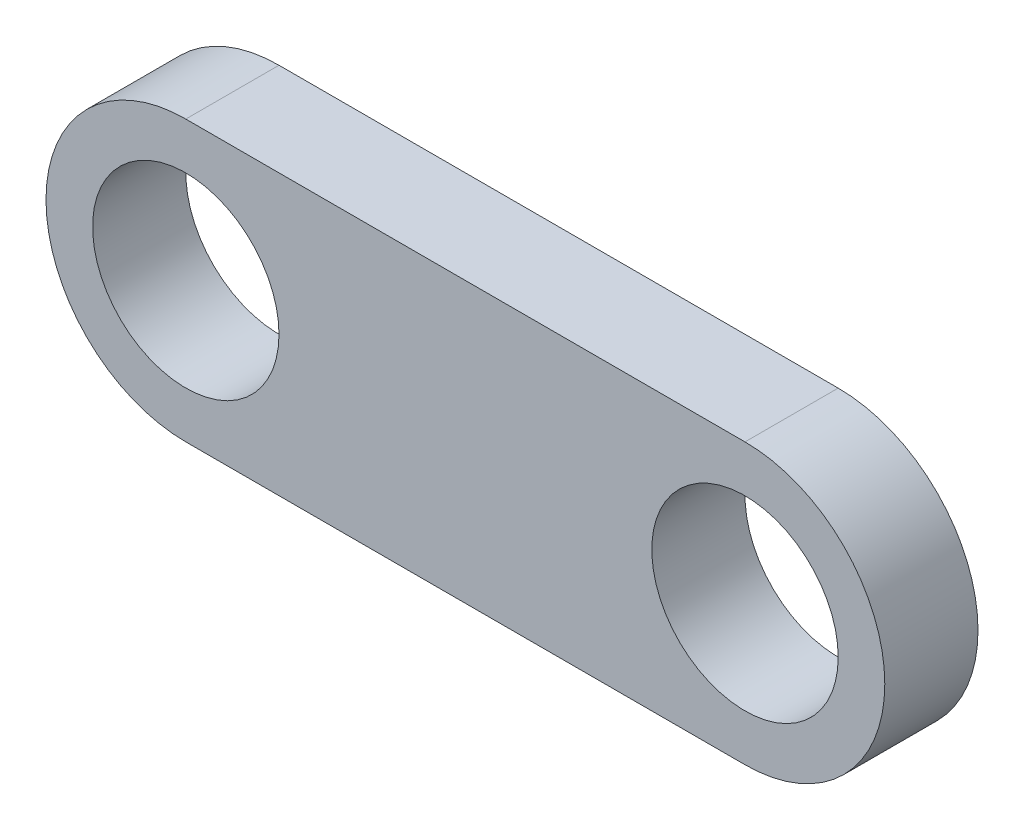
ISO-10303-21;
HEADER;
FILE_DESCRIPTION(('STEP AP214'),'2;1');
FILE_NAME('part.step','',(''),(''),'','','');
FILE_SCHEMA(('AUTOMOTIVE_DESIGN { 1 0 10303 214 1 1 1 1 }'));
ENDSEC;
DATA;
#1=APPLICATION_CONTEXT('core data for automotive mechanical design processes');
#2=APPLICATION_PROTOCOL_DEFINITION('international standard','automotive_design',2000,#1);
#3=PRODUCT_CONTEXT('',#1,'mechanical');
#4=PRODUCT('Part','Part','',(#3));
#5=PRODUCT_RELATED_PRODUCT_CATEGORY('part','',(#4));
#6=PRODUCT_DEFINITION_FORMATION('','',#4);
#7=PRODUCT_DEFINITION_CONTEXT('part definition',#1,'design');
#8=PRODUCT_DEFINITION('design','',#6,#7);
#9=PRODUCT_DEFINITION_SHAPE('','',#8);
#10=(LENGTH_UNIT() NAMED_UNIT(*) SI_UNIT(.MILLI.,.METRE.));
#11=(NAMED_UNIT(*) PLANE_ANGLE_UNIT() SI_UNIT($,.RADIAN.));
#12=(NAMED_UNIT(*) SI_UNIT($,.STERADIAN.) SOLID_ANGLE_UNIT());
#13=UNCERTAINTY_MEASURE_WITH_UNIT(LENGTH_MEASURE(1.E-05),#10,'distance_accuracy_value','');
#14=(GEOMETRIC_REPRESENTATION_CONTEXT(3) GLOBAL_UNCERTAINTY_ASSIGNED_CONTEXT((#13)) GLOBAL_UNIT_ASSIGNED_CONTEXT((#10,
#11,#12)) REPRESENTATION_CONTEXT('',''));
#15=CARTESIAN_POINT('',(0.,0.,0.));
#16=DIRECTION('',(0.,0.,1.));
#17=DIRECTION('',(1.,0.,0.));
#18=AXIS2_PLACEMENT_3D('',#15,#16,#17);
#19=CARTESIAN_POINT('',(0.,7.5,5.));
#20=DIRECTION('',(0.,-1.,0.));
#21=DIRECTION('',(1.,0.,0.));
#22=AXIS2_PLACEMENT_3D('',#19,#20,#21);
#23=PLANE('',#22);
#24=DIRECTION('',(0.,0.,1.));
#25=VECTOR('',#24,1.);
#26=CARTESIAN_POINT('',(30.,7.50000000000001,5.));
#27=LINE('',#26,#25);
#28=CARTESIAN_POINT('',(30.,7.50000000000001,0.));
#29=VERTEX_POINT('',#28);
#30=CARTESIAN_POINT('',(30.,7.50000000000001,5.));
#31=VERTEX_POINT('',#30);
#32=EDGE_CURVE('E11',#29,#31,#27,.T.);
#33=ORIENTED_EDGE('',*,*,#32,.F.);
#34=DIRECTION('',(1.,0.,0.));
#35=VECTOR('',#34,1.);
#36=CARTESIAN_POINT('',(0.,7.5,0.));
#37=LINE('',#36,#35);
#38=CARTESIAN_POINT('',(0.,7.5,0.));
#39=VERTEX_POINT('',#38);
#40=EDGE_CURVE('E101',#39,#29,#37,.T.);
#41=ORIENTED_EDGE('',*,*,#40,.F.);
#42=DIRECTION('',(0.,0.,1.));
#43=VECTOR('',#42,1.);
#44=CARTESIAN_POINT('',(0.,7.5,5.));
#45=LINE('',#44,#43);
#46=CARTESIAN_POINT('',(0.,7.5,5.));
#47=VERTEX_POINT('',#46);
#48=EDGE_CURVE('E54',#39,#47,#45,.T.);
#49=ORIENTED_EDGE('',*,*,#48,.T.);
#50=DIRECTION('',(1.,0.,0.));
#51=VECTOR('',#50,1.);
#52=CARTESIAN_POINT('',(0.,7.5,5.));
#53=LINE('',#52,#51);
#54=EDGE_CURVE('E128',#47,#31,#53,.T.);
#55=ORIENTED_EDGE('',*,*,#54,.T.);
#56=EDGE_LOOP('',(#33,#41,#49,#55));
#57=FACE_BOUND('',#56,.T.);
#58=ADVANCED_FACE('F43',(#57),#23,.F.);
#59=CARTESIAN_POINT('',(0.,0.,5.));
#60=DIRECTION('',(0.,0.,1.));
#61=DIRECTION('',(1.,0.,0.));
#62=AXIS2_PLACEMENT_3D('',#59,#60,#61);
#63=CYLINDRICAL_SURFACE('',#62,7.5);
#64=ORIENTED_EDGE('',*,*,#48,.F.);
#65=CARTESIAN_POINT('',(0.,0.,0.));
#66=DIRECTION('',(0.,0.,1.));
#67=DIRECTION('',(1.,0.,0.));
#68=AXIS2_PLACEMENT_3D('',#65,#66,#67);
#69=CIRCLE('',#68,7.5);
#70=CARTESIAN_POINT('',(0.,-7.5,0.));
#71=VERTEX_POINT('',#70);
#72=EDGE_CURVE('E110',#39,#71,#69,.T.);
#73=ORIENTED_EDGE('',*,*,#72,.T.);
#74=DIRECTION('',(0.,0.,1.));
#75=VECTOR('',#74,1.);
#76=CARTESIAN_POINT('',(0.,-7.5,5.));
#77=LINE('',#76,#75);
#78=CARTESIAN_POINT('',(0.,-7.5,5.));
#79=VERTEX_POINT('',#78);
#80=EDGE_CURVE('E62',#71,#79,#77,.T.);
#81=ORIENTED_EDGE('',*,*,#80,.T.);
#82=CARTESIAN_POINT('',(0.,0.,5.));
#83=DIRECTION('',(0.,0.,1.));
#84=DIRECTION('',(1.,0.,0.));
#85=AXIS2_PLACEMENT_3D('',#82,#83,#84);
#86=CIRCLE('',#85,7.5);
#87=EDGE_CURVE('E133',#47,#79,#86,.T.);
#88=ORIENTED_EDGE('',*,*,#87,.F.);
#89=EDGE_LOOP('',(#64,#73,#81,#88));
#90=FACE_BOUND('',#89,.T.);
#91=ADVANCED_FACE('F136',(#90),#63,.T.);
#92=CARTESIAN_POINT('',(0.,-7.5,5.));
#93=DIRECTION('',(0.,-1.,0.));
#94=DIRECTION('',(1.,0.,0.));
#95=AXIS2_PLACEMENT_3D('',#92,#93,#94);
#96=PLANE('',#95);
#97=ORIENTED_EDGE('',*,*,#80,.F.);
#98=DIRECTION('',(1.,0.,0.));
#99=VECTOR('',#98,1.);
#100=CARTESIAN_POINT('',(0.,-7.5,0.));
#101=LINE('',#100,#99);
#102=CARTESIAN_POINT('',(30.,-7.50000000000001,0.));
#103=VERTEX_POINT('',#102);
#104=EDGE_CURVE('E100',#71,#103,#101,.T.);
#105=ORIENTED_EDGE('',*,*,#104,.T.);
#106=DIRECTION('',(0.,0.,1.));
#107=VECTOR('',#106,1.);
#108=CARTESIAN_POINT('',(30.,-7.50000000000001,5.));
#109=LINE('',#108,#107);
#110=CARTESIAN_POINT('',(30.,-7.50000000000001,5.));
#111=VERTEX_POINT('',#110);
#112=EDGE_CURVE('E47',#103,#111,#109,.T.);
#113=ORIENTED_EDGE('',*,*,#112,.T.);
#114=DIRECTION('',(1.,0.,0.));
#115=VECTOR('',#114,1.);
#116=CARTESIAN_POINT('',(0.,-7.5,5.));
#117=LINE('',#116,#115);
#118=EDGE_CURVE('E123',#79,#111,#117,.T.);
#119=ORIENTED_EDGE('',*,*,#118,.F.);
#120=EDGE_LOOP('',(#97,#105,#113,#119));
#121=FACE_BOUND('',#120,.T.);
#122=ADVANCED_FACE('F104',(#121),#96,.T.);
#123=CARTESIAN_POINT('',(30.,0.,5.));
#124=DIRECTION('',(0.,0.,1.));
#125=DIRECTION('',(1.,0.,0.));
#126=AXIS2_PLACEMENT_3D('',#123,#124,#125);
#127=CYLINDRICAL_SURFACE('',#126,7.50000000000001);
#128=CARTESIAN_POINT('',(30.,0.,0.));
#129=DIRECTION('',(0.,0.,1.));
#130=DIRECTION('',(1.,0.,0.));
#131=AXIS2_PLACEMENT_3D('',#128,#129,#130);
#132=CIRCLE('',#131,7.50000000000001);
#133=EDGE_CURVE('E87',#103,#29,#132,.T.);
#134=ORIENTED_EDGE('',*,*,#133,.T.);
#135=ORIENTED_EDGE('',*,*,#32,.T.);
#136=CARTESIAN_POINT('',(30.,0.,5.));
#137=DIRECTION('',(0.,0.,1.));
#138=DIRECTION('',(1.,0.,0.));
#139=AXIS2_PLACEMENT_3D('',#136,#137,#138);
#140=CIRCLE('',#139,7.50000000000001);
#141=EDGE_CURVE('E89',#111,#31,#140,.T.);
#142=ORIENTED_EDGE('',*,*,#141,.F.);
#143=ORIENTED_EDGE('',*,*,#112,.F.);
#144=EDGE_LOOP('',(#134,#135,#142,#143));
#145=FACE_BOUND('',#144,.T.);
#146=ADVANCED_FACE('F86',(#145),#127,.T.);
#147=CARTESIAN_POINT('',(0.,0.,5.));
#148=DIRECTION('',(0.,0.,1.));
#149=DIRECTION('',(1.,0.,0.));
#150=AXIS2_PLACEMENT_3D('',#147,#148,#149);
#151=CYLINDRICAL_SURFACE('',#150,5.);
#152=CARTESIAN_POINT('',(0.,0.,5.));
#153=DIRECTION('',(0.,0.,1.));
#154=DIRECTION('',(1.,0.,0.));
#155=AXIS2_PLACEMENT_3D('',#152,#153,#154);
#156=CIRCLE('',#155,5.);
#157=CARTESIAN_POINT('',(5.,0.,5.));
#158=VERTEX_POINT('',#157);
#159=EDGE_CURVE('E138',#158,#158,#156,.T.);
#160=ORIENTED_EDGE('',*,*,#159,.T.);
#161=EDGE_LOOP('',(#160));
#162=FACE_BOUND('',#161,.T.);
#163=CARTESIAN_POINT('',(0.,0.,0.));
#164=DIRECTION('',(0.,0.,1.));
#165=DIRECTION('',(1.,0.,0.));
#166=AXIS2_PLACEMENT_3D('',#163,#164,#165);
#167=CIRCLE('',#166,5.);
#168=CARTESIAN_POINT('',(5.,0.,0.));
#169=VERTEX_POINT('',#168);
#170=EDGE_CURVE('E113',#169,#169,#167,.T.);
#171=ORIENTED_EDGE('',*,*,#170,.F.);
#172=EDGE_LOOP('',(#171));
#173=FACE_BOUND('',#172,.T.);
#174=ADVANCED_FACE('F162',(#162,#173),#151,.F.);
#175=CARTESIAN_POINT('',(30.,0.,5.));
#176=DIRECTION('',(0.,0.,1.));
#177=DIRECTION('',(1.,0.,0.));
#178=AXIS2_PLACEMENT_3D('',#175,#176,#177);
#179=CYLINDRICAL_SURFACE('',#178,5.);
#180=CARTESIAN_POINT('',(30.,0.,5.));
#181=DIRECTION('',(0.,0.,1.));
#182=DIRECTION('',(1.,0.,0.));
#183=AXIS2_PLACEMENT_3D('',#180,#181,#182);
#184=CIRCLE('',#183,5.);
#185=CARTESIAN_POINT('',(35.,0.,5.));
#186=VERTEX_POINT('',#185);
#187=EDGE_CURVE('E94',#186,#186,#184,.T.);
#188=ORIENTED_EDGE('',*,*,#187,.T.);
#189=EDGE_LOOP('',(#188));
#190=FACE_BOUND('',#189,.T.);
#191=CARTESIAN_POINT('',(30.,0.,0.));
#192=DIRECTION('',(0.,0.,1.));
#193=DIRECTION('',(1.,0.,0.));
#194=AXIS2_PLACEMENT_3D('',#191,#192,#193);
#195=CIRCLE('',#194,5.);
#196=CARTESIAN_POINT('',(35.,0.,0.));
#197=VERTEX_POINT('',#196);
#198=EDGE_CURVE('E119',#197,#197,#195,.T.);
#199=ORIENTED_EDGE('',*,*,#198,.F.);
#200=EDGE_LOOP('',(#199));
#201=FACE_BOUND('',#200,.T.);
#202=ADVANCED_FACE('F45',(#190,#201),#179,.F.);
#203=CARTESIAN_POINT('',(0.,0.,5.));
#204=DIRECTION('',(0.,0.,1.));
#205=DIRECTION('',(1.,0.,0.));
#206=AXIS2_PLACEMENT_3D('',#203,#204,#205);
#207=PLANE('',#206);
#208=ORIENTED_EDGE('',*,*,#118,.T.);
#209=ORIENTED_EDGE('',*,*,#141,.T.);
#210=ORIENTED_EDGE('',*,*,#54,.F.);
#211=ORIENTED_EDGE('',*,*,#87,.T.);
#212=EDGE_LOOP('',(#208,#209,#210,#211));
#213=FACE_BOUND('',#212,.T.);
#214=ORIENTED_EDGE('',*,*,#159,.F.);
#215=EDGE_LOOP('',(#214));
#216=FACE_BOUND('',#215,.T.);
#217=ORIENTED_EDGE('',*,*,#187,.F.);
#218=EDGE_LOOP('',(#217));
#219=FACE_BOUND('',#218,.T.);
#220=ADVANCED_FACE('F131',(#213,#216,#219),#207,.T.);
#221=CARTESIAN_POINT('',(0.,0.,0.));
#222=DIRECTION('',(0.,0.,1.));
#223=DIRECTION('',(1.,0.,0.));
#224=AXIS2_PLACEMENT_3D('',#221,#222,#223);
#225=PLANE('',#224);
#226=ORIENTED_EDGE('',*,*,#104,.F.);
#227=ORIENTED_EDGE('',*,*,#72,.F.);
#228=ORIENTED_EDGE('',*,*,#40,.T.);
#229=ORIENTED_EDGE('',*,*,#133,.F.);
#230=EDGE_LOOP('',(#226,#227,#228,#229));
#231=FACE_BOUND('',#230,.T.);
#232=ORIENTED_EDGE('',*,*,#170,.T.);
#233=EDGE_LOOP('',(#232));
#234=FACE_BOUND('',#233,.T.);
#235=ORIENTED_EDGE('',*,*,#198,.T.);
#236=EDGE_LOOP('',(#235));
#237=FACE_BOUND('',#236,.T.);
#238=ADVANCED_FACE('F97',(#231,#234,#237),#225,.F.);
#239=CLOSED_SHELL('',(#58,#91,#122,#146,#174,#202,#220,#238));
#240=MANIFOLD_SOLID_BREP('B2',#239);
#241=ADVANCED_BREP_SHAPE_REPRESENTATION('',(#18,#240),#14);
#242=SHAPE_DEFINITION_REPRESENTATION(#9,#241);
ENDSEC;
END-ISO-10303-21;
